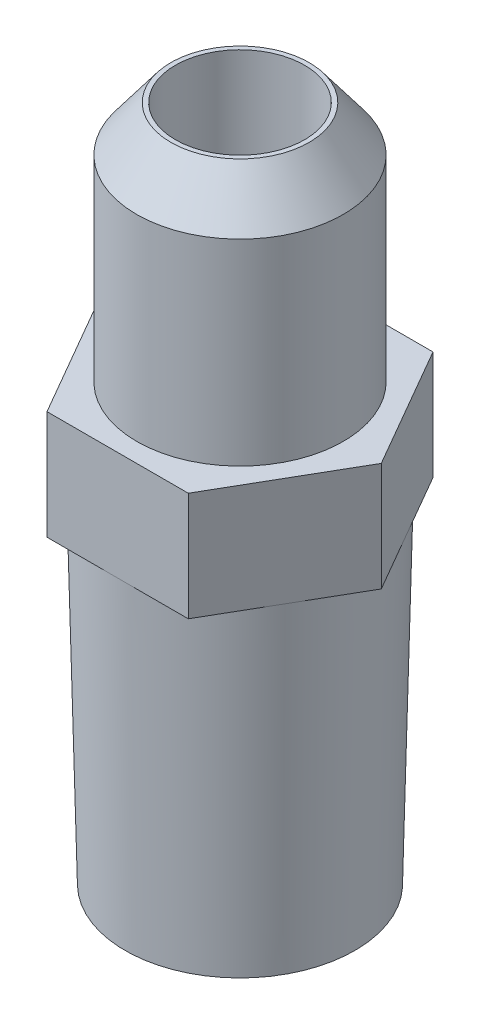
ISO-10303-21;
HEADER;
FILE_DESCRIPTION(('STEP AP214'),'2;1');
FILE_NAME('part.step','',(''),(''),'','','');
FILE_SCHEMA(('AUTOMOTIVE_DESIGN { 1 0 10303 214 1 1 1 1 }'));
ENDSEC;
DATA;
#1=APPLICATION_CONTEXT('core data for automotive mechanical design processes');
#2=APPLICATION_PROTOCOL_DEFINITION('international standard','automotive_design',2000,#1);
#3=PRODUCT_CONTEXT('',#1,'mechanical');
#4=PRODUCT('Part','Part','',(#3));
#5=PRODUCT_RELATED_PRODUCT_CATEGORY('part','',(#4));
#6=PRODUCT_DEFINITION_FORMATION('','',#4);
#7=PRODUCT_DEFINITION_CONTEXT('part definition',#1,'design');
#8=PRODUCT_DEFINITION('design','',#6,#7);
#9=PRODUCT_DEFINITION_SHAPE('','',#8);
#10=(LENGTH_UNIT() NAMED_UNIT(*) SI_UNIT(.MILLI.,.METRE.));
#11=(NAMED_UNIT(*) PLANE_ANGLE_UNIT() SI_UNIT($,.RADIAN.));
#12=(NAMED_UNIT(*) SI_UNIT($,.STERADIAN.) SOLID_ANGLE_UNIT());
#13=UNCERTAINTY_MEASURE_WITH_UNIT(LENGTH_MEASURE(1.E-05),#10,'distance_accuracy_value','');
#14=(GEOMETRIC_REPRESENTATION_CONTEXT(3) GLOBAL_UNCERTAINTY_ASSIGNED_CONTEXT((#13)) GLOBAL_UNIT_ASSIGNED_CONTEXT((#10,
#11,#12)) REPRESENTATION_CONTEXT('',''));
#15=CARTESIAN_POINT('',(0.,0.,0.));
#16=DIRECTION('',(0.,0.,1.));
#17=DIRECTION('',(1.,0.,0.));
#18=AXIS2_PLACEMENT_3D('',#15,#16,#17);
#19=CARTESIAN_POINT('',(0.,0.,0.));
#20=DIRECTION('',(0.,1.,0.));
#21=DIRECTION('',(0.,0.,1.));
#22=AXIS2_PLACEMENT_3D('',#19,#20,#21);
#23=PLANE('',#22);
#24=CARTESIAN_POINT('',(0.,0.,0.));
#25=DIRECTION('',(0.,-1.,0.));
#26=DIRECTION('',(0.,0.,-1.));
#27=AXIS2_PLACEMENT_3D('',#24,#25,#26);
#28=CIRCLE('',#27,7.14375);
#29=CARTESIAN_POINT('',(0.,0.,-7.14375));
#30=VERTEX_POINT('',#29);
#31=CARTESIAN_POINT('',(6.18666897828508,0.,-3.571875));
#32=VERTEX_POINT('',#31);
#33=EDGE_CURVE('E51',#30,#32,#28,.T.);
#34=ORIENTED_EDGE('',*,*,#33,.F.);
#35=DIRECTION('',(-1.,0.,0.));
#36=VECTOR('',#35,1.);
#37=CARTESIAN_POINT('',(4.12444598552338,0.,-7.14375));
#38=LINE('',#37,#36);
#39=CARTESIAN_POINT('',(4.12444598552338,0.,-7.14375));
#40=VERTEX_POINT('',#39);
#41=EDGE_CURVE('E117',#40,#30,#38,.T.);
#42=ORIENTED_EDGE('',*,*,#41,.F.);
#43=DIRECTION('',(-0.5,0.,-0.866025403784439));
#44=VECTOR('',#43,1.);
#45=CARTESIAN_POINT('',(8.24889197104677,0.,0.));
#46=LINE('',#45,#44);
#47=EDGE_CURVE('E142',#32,#40,#46,.T.);
#48=ORIENTED_EDGE('',*,*,#47,.F.);
#49=EDGE_LOOP('',(#34,#42,#48));
#50=FACE_BOUND('',#49,.T.);
#51=ADVANCED_FACE('F39',(#50),#23,.F.);
#52=CARTESIAN_POINT('',(6.18666897828508,0.,3.57187499999999));
#53=VERTEX_POINT('',#52);
#54=EDGE_CURVE('E11',#32,#53,#28,.T.);
#55=ORIENTED_EDGE('',*,*,#54,.F.);
#56=CARTESIAN_POINT('',(8.24889197104677,0.,0.));
#57=VERTEX_POINT('',#56);
#58=EDGE_CURVE('E140',#57,#32,#46,.T.);
#59=ORIENTED_EDGE('',*,*,#58,.F.);
#60=DIRECTION('',(0.5,0.,-0.866025403784439));
#61=VECTOR('',#60,1.);
#62=CARTESIAN_POINT('',(4.12444598552338,0.,7.14375));
#63=LINE('',#62,#61);
#64=EDGE_CURVE('E202',#53,#57,#63,.T.);
#65=ORIENTED_EDGE('',*,*,#64,.F.);
#66=EDGE_LOOP('',(#55,#59,#65));
#67=FACE_BOUND('',#66,.T.);
#68=ADVANCED_FACE('F252',(#67),#23,.F.);
#69=CARTESIAN_POINT('',(0.,0.,7.14375));
#70=VERTEX_POINT('',#69);
#71=EDGE_CURVE('E49',#53,#70,#28,.T.);
#72=ORIENTED_EDGE('',*,*,#71,.F.);
#73=CARTESIAN_POINT('',(4.12444598552338,0.,7.14375));
#74=VERTEX_POINT('',#73);
#75=EDGE_CURVE('E203',#74,#53,#63,.T.);
#76=ORIENTED_EDGE('',*,*,#75,.F.);
#77=DIRECTION('',(1.,0.,0.));
#78=VECTOR('',#77,1.);
#79=CARTESIAN_POINT('',(-4.12444598552339,0.,7.14375));
#80=LINE('',#79,#78);
#81=EDGE_CURVE('E197',#70,#74,#80,.T.);
#82=ORIENTED_EDGE('',*,*,#81,.F.);
#83=EDGE_LOOP('',(#72,#76,#82));
#84=FACE_BOUND('',#83,.T.);
#85=ADVANCED_FACE('F245',(#84),#23,.F.);
#86=CARTESIAN_POINT('',(-6.18666897828508,0.,3.571875));
#87=VERTEX_POINT('',#86);
#88=EDGE_CURVE('E65',#70,#87,#28,.T.);
#89=ORIENTED_EDGE('',*,*,#88,.F.);
#90=CARTESIAN_POINT('',(-4.12444598552339,0.,7.14375));
#91=VERTEX_POINT('',#90);
#92=EDGE_CURVE('E198',#91,#70,#80,.T.);
#93=ORIENTED_EDGE('',*,*,#92,.F.);
#94=DIRECTION('',(0.5,0.,0.866025403784439));
#95=VECTOR('',#94,1.);
#96=CARTESIAN_POINT('',(-8.24889197104678,0.,0.));
#97=LINE('',#96,#95);
#98=EDGE_CURVE('E192',#87,#91,#97,.T.);
#99=ORIENTED_EDGE('',*,*,#98,.F.);
#100=EDGE_LOOP('',(#89,#93,#99));
#101=FACE_BOUND('',#100,.T.);
#102=ADVANCED_FACE('F237',(#101),#23,.F.);
#103=CARTESIAN_POINT('',(-6.18666897828509,0.,-3.571875));
#104=VERTEX_POINT('',#103);
#105=EDGE_CURVE('E58',#87,#104,#28,.T.);
#106=ORIENTED_EDGE('',*,*,#105,.F.);
#107=CARTESIAN_POINT('',(-8.24889197104678,0.,0.));
#108=VERTEX_POINT('',#107);
#109=EDGE_CURVE('E193',#108,#87,#97,.T.);
#110=ORIENTED_EDGE('',*,*,#109,.F.);
#111=DIRECTION('',(-0.5,0.,0.866025403784439));
#112=VECTOR('',#111,1.);
#113=CARTESIAN_POINT('',(-4.12444598552339,0.,-7.14375));
#114=LINE('',#113,#112);
#115=EDGE_CURVE('E169',#104,#108,#114,.T.);
#116=ORIENTED_EDGE('',*,*,#115,.F.);
#117=EDGE_LOOP('',(#106,#110,#116));
#118=FACE_BOUND('',#117,.T.);
#119=ADVANCED_FACE('F234',(#118),#23,.F.);
#120=CARTESIAN_POINT('',(0.,20.4724,0.));
#121=DIRECTION('',(0.,-1.,0.));
#122=DIRECTION('',(0.,0.,-1.));
#123=AXIS2_PLACEMENT_3D('',#120,#121,#122);
#124=CYLINDRICAL_SURFACE('',#123,6.0325);
#125=CARTESIAN_POINT('',(0.,6.35,0.));
#126=DIRECTION('',(0.,1.,0.));
#127=DIRECTION('',(0.,0.,1.));
#128=AXIS2_PLACEMENT_3D('',#125,#126,#127);
#129=CIRCLE('',#128,6.0325);
#130=CARTESIAN_POINT('',(0.,6.35,6.0325));
#131=VERTEX_POINT('',#130);
#132=EDGE_CURVE('E150',#131,#131,#129,.T.);
#133=ORIENTED_EDGE('',*,*,#132,.T.);
#134=EDGE_LOOP('',(#133));
#135=FACE_BOUND('',#134,.T.);
#136=CARTESIAN_POINT('',(0.,17.8264053301711,0.));
#137=DIRECTION('',(0.,-1.,0.));
#138=DIRECTION('',(0.,0.,-1.));
#139=AXIS2_PLACEMENT_3D('',#136,#137,#138);
#140=CIRCLE('',#139,6.0325);
#141=CARTESIAN_POINT('',(0.,17.8264053301711,-6.0325));
#142=VERTEX_POINT('',#141);
#143=EDGE_CURVE('E166',#142,#142,#140,.F.);
#144=ORIENTED_EDGE('',*,*,#143,.F.);
#145=EDGE_LOOP('',(#144));
#146=FACE_BOUND('',#145,.T.);
#147=ADVANCED_FACE('F236',(#135,#146),#124,.T.);
#148=CARTESIAN_POINT('',(-4.12444598552339,6.35,-7.14375));
#149=DIRECTION('',(0.866025403784439,0.,0.5));
#150=DIRECTION('',(0.5,0.,-0.866025403784439));
#151=AXIS2_PLACEMENT_3D('',#148,#149,#150);
#152=PLANE('',#151);
#153=CARTESIAN_POINT('',(-4.12444598552339,0.,-7.14375));
#154=VERTEX_POINT('',#153);
#155=EDGE_CURVE('E138',#154,#104,#114,.T.);
#156=ORIENTED_EDGE('',*,*,#155,.T.);
#157=ORIENTED_EDGE('',*,*,#115,.T.);
#158=DIRECTION('',(0.,-1.,0.));
#159=VECTOR('',#158,1.);
#160=CARTESIAN_POINT('',(-8.24889197104678,6.35,0.));
#161=LINE('',#160,#159);
#162=CARTESIAN_POINT('',(-8.24889197104678,6.35,0.));
#163=VERTEX_POINT('',#162);
#164=EDGE_CURVE('E43',#163,#108,#161,.T.);
#165=ORIENTED_EDGE('',*,*,#164,.F.);
#166=DIRECTION('',(-0.5,0.,0.866025403784439));
#167=VECTOR('',#166,1.);
#168=CARTESIAN_POINT('',(-4.12444598552339,6.35,-7.14375));
#169=LINE('',#168,#167);
#170=CARTESIAN_POINT('',(-4.12444598552339,6.35,-7.14375));
#171=VERTEX_POINT('',#170);
#172=EDGE_CURVE('E130',#171,#163,#169,.T.);
#173=ORIENTED_EDGE('',*,*,#172,.F.);
#174=DIRECTION('',(0.,-1.,0.));
#175=VECTOR('',#174,1.);
#176=CARTESIAN_POINT('',(-4.12444598552339,6.35,-7.14375));
#177=LINE('',#176,#175);
#178=EDGE_CURVE('E189',#171,#154,#177,.T.);
#179=ORIENTED_EDGE('',*,*,#178,.T.);
#180=EDGE_LOOP('',(#156,#157,#165,#173,#179));
#181=FACE_BOUND('',#180,.T.);
#182=ADVANCED_FACE('F41',(#181),#152,.F.);
#183=CARTESIAN_POINT('',(-8.24889197104678,6.35,0.));
#184=DIRECTION('',(0.866025403784439,0.,-0.5));
#185=DIRECTION('',(-0.5,0.,-0.866025403784439));
#186=AXIS2_PLACEMENT_3D('',#183,#184,#185);
#187=PLANE('',#186);
#188=ORIENTED_EDGE('',*,*,#109,.T.);
#189=ORIENTED_EDGE('',*,*,#98,.T.);
#190=DIRECTION('',(0.,-1.,0.));
#191=VECTOR('',#190,1.);
#192=CARTESIAN_POINT('',(-4.12444598552339,6.35,7.14375));
#193=LINE('',#192,#191);
#194=CARTESIAN_POINT('',(-4.12444598552339,6.35,7.14375));
#195=VERTEX_POINT('',#194);
#196=EDGE_CURVE('E220',#195,#91,#193,.T.);
#197=ORIENTED_EDGE('',*,*,#196,.F.);
#198=DIRECTION('',(0.5,0.,0.866025403784439));
#199=VECTOR('',#198,1.);
#200=CARTESIAN_POINT('',(-8.24889197104678,6.35,0.));
#201=LINE('',#200,#199);
#202=EDGE_CURVE('E174',#163,#195,#201,.T.);
#203=ORIENTED_EDGE('',*,*,#202,.F.);
#204=ORIENTED_EDGE('',*,*,#164,.T.);
#205=EDGE_LOOP('',(#188,#189,#197,#203,#204));
#206=FACE_BOUND('',#205,.T.);
#207=ADVANCED_FACE('F230',(#206),#187,.F.);
#208=CARTESIAN_POINT('',(-4.12444598552339,6.35,7.14375));
#209=DIRECTION('',(0.,0.,-1.));
#210=DIRECTION('',(-1.,0.,0.));
#211=AXIS2_PLACEMENT_3D('',#208,#209,#210);
#212=PLANE('',#211);
#213=ORIENTED_EDGE('',*,*,#92,.T.);
#214=ORIENTED_EDGE('',*,*,#81,.T.);
#215=DIRECTION('',(0.,-1.,0.));
#216=VECTOR('',#215,1.);
#217=CARTESIAN_POINT('',(4.12444598552338,6.35,7.14375));
#218=LINE('',#217,#216);
#219=CARTESIAN_POINT('',(4.12444598552338,6.35,7.14375));
#220=VERTEX_POINT('',#219);
#221=EDGE_CURVE('E217',#220,#74,#218,.T.);
#222=ORIENTED_EDGE('',*,*,#221,.F.);
#223=DIRECTION('',(1.,0.,0.));
#224=VECTOR('',#223,1.);
#225=CARTESIAN_POINT('',(-4.12444598552339,6.35,7.14375));
#226=LINE('',#225,#224);
#227=EDGE_CURVE('E177',#195,#220,#226,.T.);
#228=ORIENTED_EDGE('',*,*,#227,.F.);
#229=ORIENTED_EDGE('',*,*,#196,.T.);
#230=EDGE_LOOP('',(#213,#214,#222,#228,#229));
#231=FACE_BOUND('',#230,.T.);
#232=ADVANCED_FACE('F269',(#231),#212,.F.);
#233=CARTESIAN_POINT('',(4.12444598552338,6.35,7.14375));
#234=DIRECTION('',(-0.866025403784439,0.,-0.5));
#235=DIRECTION('',(-0.5,0.,0.866025403784439));
#236=AXIS2_PLACEMENT_3D('',#233,#234,#235);
#237=PLANE('',#236);
#238=ORIENTED_EDGE('',*,*,#75,.T.);
#239=ORIENTED_EDGE('',*,*,#64,.T.);
#240=DIRECTION('',(0.,-1.,0.));
#241=VECTOR('',#240,1.);
#242=CARTESIAN_POINT('',(8.24889197104677,6.35,0.));
#243=LINE('',#242,#241);
#244=CARTESIAN_POINT('',(8.24889197104677,6.35,0.));
#245=VERTEX_POINT('',#244);
#246=EDGE_CURVE('E213',#245,#57,#243,.T.);
#247=ORIENTED_EDGE('',*,*,#246,.F.);
#248=DIRECTION('',(0.5,0.,-0.866025403784439));
#249=VECTOR('',#248,1.);
#250=CARTESIAN_POINT('',(4.12444598552338,6.35,7.14375));
#251=LINE('',#250,#249);
#252=EDGE_CURVE('E180',#220,#245,#251,.T.);
#253=ORIENTED_EDGE('',*,*,#252,.F.);
#254=ORIENTED_EDGE('',*,*,#221,.T.);
#255=EDGE_LOOP('',(#238,#239,#247,#253,#254));
#256=FACE_BOUND('',#255,.T.);
#257=ADVANCED_FACE('F309',(#256),#237,.F.);
#258=CARTESIAN_POINT('',(8.24889197104677,6.35,0.));
#259=DIRECTION('',(-0.866025403784439,0.,0.5));
#260=DIRECTION('',(0.5,0.,0.866025403784439));
#261=AXIS2_PLACEMENT_3D('',#258,#259,#260);
#262=PLANE('',#261);
#263=ORIENTED_EDGE('',*,*,#58,.T.);
#264=ORIENTED_EDGE('',*,*,#47,.T.);
#265=DIRECTION('',(0.,-1.,0.));
#266=VECTOR('',#265,1.);
#267=CARTESIAN_POINT('',(4.12444598552338,6.35,-7.14375));
#268=LINE('',#267,#266);
#269=CARTESIAN_POINT('',(4.12444598552338,6.35,-7.14375));
#270=VERTEX_POINT('',#269);
#271=EDGE_CURVE('E125',#270,#40,#268,.T.);
#272=ORIENTED_EDGE('',*,*,#271,.F.);
#273=DIRECTION('',(-0.5,0.,-0.866025403784439));
#274=VECTOR('',#273,1.);
#275=CARTESIAN_POINT('',(8.24889197104677,6.35,0.));
#276=LINE('',#275,#274);
#277=EDGE_CURVE('E183',#245,#270,#276,.T.);
#278=ORIENTED_EDGE('',*,*,#277,.F.);
#279=ORIENTED_EDGE('',*,*,#246,.T.);
#280=EDGE_LOOP('',(#263,#264,#272,#278,#279));
#281=FACE_BOUND('',#280,.T.);
#282=ADVANCED_FACE('F299',(#281),#262,.F.);
#283=CARTESIAN_POINT('',(4.12444598552338,6.35,-7.14375));
#284=DIRECTION('',(0.,0.,1.));
#285=DIRECTION('',(1.,0.,0.));
#286=AXIS2_PLACEMENT_3D('',#283,#284,#285);
#287=PLANE('',#286);
#288=ORIENTED_EDGE('',*,*,#41,.T.);
#289=EDGE_CURVE('E121',#30,#154,#38,.T.);
#290=ORIENTED_EDGE('',*,*,#289,.T.);
#291=ORIENTED_EDGE('',*,*,#178,.F.);
#292=DIRECTION('',(-1.,0.,0.));
#293=VECTOR('',#292,1.);
#294=CARTESIAN_POINT('',(4.12444598552338,6.35,-7.14375));
#295=LINE('',#294,#293);
#296=EDGE_CURVE('E186',#270,#171,#295,.T.);
#297=ORIENTED_EDGE('',*,*,#296,.F.);
#298=ORIENTED_EDGE('',*,*,#271,.T.);
#299=EDGE_LOOP('',(#288,#290,#291,#297,#298));
#300=FACE_BOUND('',#299,.T.);
#301=ADVANCED_FACE('F119',(#300),#287,.F.);
#302=CARTESIAN_POINT('',(0.,6.35,0.));
#303=DIRECTION('',(0.,1.,0.));
#304=DIRECTION('',(0.,0.,1.));
#305=AXIS2_PLACEMENT_3D('',#302,#303,#304);
#306=PLANE('',#305);
#307=ORIENTED_EDGE('',*,*,#132,.F.);
#308=EDGE_LOOP('',(#307));
#309=FACE_BOUND('',#308,.T.);
#310=ORIENTED_EDGE('',*,*,#172,.T.);
#311=ORIENTED_EDGE('',*,*,#202,.T.);
#312=ORIENTED_EDGE('',*,*,#227,.T.);
#313=ORIENTED_EDGE('',*,*,#252,.T.);
#314=ORIENTED_EDGE('',*,*,#277,.T.);
#315=ORIENTED_EDGE('',*,*,#296,.T.);
#316=EDGE_LOOP('',(#310,#311,#312,#313,#314,#315));
#317=FACE_BOUND('',#316,.T.);
#318=ADVANCED_FACE('F250',(#309,#317),#306,.T.);
#319=EDGE_CURVE('E136',#104,#30,#28,.T.);
#320=ORIENTED_EDGE('',*,*,#319,.F.);
#321=ORIENTED_EDGE('',*,*,#155,.F.);
#322=ORIENTED_EDGE('',*,*,#289,.F.);
#323=EDGE_LOOP('',(#320,#321,#322));
#324=FACE_BOUND('',#323,.T.);
#325=ADVANCED_FACE('F134',(#324),#23,.F.);
#326=CARTESIAN_POINT('',(0.,20.4724,0.));
#327=DIRECTION('',(0.,-1.,0.));
#328=DIRECTION('',(0.,0.,1.));
#329=AXIS2_PLACEMENT_3D('',#326,#327,#328);
#330=CONICAL_SURFACE('',#329,4.0386,0.645771823237903);
#331=CARTESIAN_POINT('',(0.,20.4724,0.));
#332=DIRECTION('',(0.,1.,0.));
#333=DIRECTION('',(0.,0.,1.));
#334=AXIS2_PLACEMENT_3D('',#331,#332,#333);
#335=CIRCLE('',#334,4.0386);
#336=CARTESIAN_POINT('',(0.,20.4724,4.0386));
#337=VERTEX_POINT('',#336);
#338=EDGE_CURVE('E162',#337,#337,#335,.T.);
#339=ORIENTED_EDGE('',*,*,#338,.F.);
#340=EDGE_LOOP('',(#339));
#341=FACE_BOUND('',#340,.T.);
#342=ORIENTED_EDGE('',*,*,#143,.T.);
#343=EDGE_LOOP('',(#342));
#344=FACE_BOUND('',#343,.T.);
#345=ADVANCED_FACE('F249',(#341,#344),#330,.T.);
#346=CARTESIAN_POINT('',(0.,20.4724,0.));
#347=DIRECTION('',(0.,1.,0.));
#348=DIRECTION('',(0.,0.,1.));
#349=AXIS2_PLACEMENT_3D('',#346,#347,#348);
#350=PLANE('',#349);
#351=CARTESIAN_POINT('',(0.,20.4724,0.));
#352=DIRECTION('',(0.,1.,0.));
#353=DIRECTION('',(0.,0.,1.));
#354=AXIS2_PLACEMENT_3D('',#351,#352,#353);
#355=CIRCLE('',#354,3.7719);
#356=CARTESIAN_POINT('',(0.,20.4724,3.7719));
#357=VERTEX_POINT('',#356);
#358=EDGE_CURVE('E157',#357,#357,#355,.T.);
#359=ORIENTED_EDGE('',*,*,#358,.F.);
#360=EDGE_LOOP('',(#359));
#361=FACE_BOUND('',#360,.T.);
#362=ORIENTED_EDGE('',*,*,#338,.T.);
#363=EDGE_LOOP('',(#362));
#364=FACE_BOUND('',#363,.T.);
#365=ADVANCED_FACE('F279',(#361,#364),#350,.T.);
#366=CARTESIAN_POINT('',(0.,0.,0.));
#367=DIRECTION('',(0.,1.,0.));
#368=DIRECTION('',(0.,0.,-1.));
#369=AXIS2_PLACEMENT_3D('',#366,#367,#368);
#370=CONICAL_SURFACE('',#369,7.14375,0.0226892802759263);
#371=CARTESIAN_POINT('',(0.,-19.05,0.));
#372=DIRECTION('',(0.,-1.,0.));
#373=DIRECTION('',(0.,0.,-1.));
#374=AXIS2_PLACEMENT_3D('',#371,#372,#373);
#375=CIRCLE('',#374,6.71144502416799);
#376=CARTESIAN_POINT('',(0.,-19.05,-6.71144502416799));
#377=VERTEX_POINT('',#376);
#378=EDGE_CURVE('E146',#377,#377,#375,.T.);
#379=ORIENTED_EDGE('',*,*,#378,.F.);
#380=EDGE_LOOP('',(#379));
#381=FACE_BOUND('',#380,.T.);
#382=ORIENTED_EDGE('',*,*,#33,.T.);
#383=ORIENTED_EDGE('',*,*,#54,.T.);
#384=ORIENTED_EDGE('',*,*,#71,.T.);
#385=ORIENTED_EDGE('',*,*,#88,.T.);
#386=ORIENTED_EDGE('',*,*,#105,.T.);
#387=ORIENTED_EDGE('',*,*,#319,.T.);
#388=EDGE_LOOP('',(#382,#383,#384,#385,#386,#387));
#389=FACE_BOUND('',#388,.T.);
#390=ADVANCED_FACE('F148',(#381,#389),#370,.T.);
#391=CARTESIAN_POINT('',(0.,-19.05,0.));
#392=DIRECTION('',(0.,-1.,0.));
#393=DIRECTION('',(0.,0.,-1.));
#394=AXIS2_PLACEMENT_3D('',#391,#392,#393);
#395=PLANE('',#394);
#396=CARTESIAN_POINT('',(0.,-19.05,0.));
#397=DIRECTION('',(0.,1.,0.));
#398=DIRECTION('',(0.,0.,1.));
#399=AXIS2_PLACEMENT_3D('',#396,#397,#398);
#400=CIRCLE('',#399,3.7719);
#401=CARTESIAN_POINT('',(0.,-19.05,3.7719));
#402=VERTEX_POINT('',#401);
#403=EDGE_CURVE('E147',#402,#402,#400,.T.);
#404=ORIENTED_EDGE('',*,*,#403,.T.);
#405=EDGE_LOOP('',(#404));
#406=FACE_BOUND('',#405,.T.);
#407=ORIENTED_EDGE('',*,*,#378,.T.);
#408=EDGE_LOOP('',(#407));
#409=FACE_BOUND('',#408,.T.);
#410=ADVANCED_FACE('F369',(#406,#409),#395,.T.);
#411=CARTESIAN_POINT('',(0.,-19.05,0.));
#412=DIRECTION('',(0.,1.,0.));
#413=DIRECTION('',(0.,0.,1.));
#414=AXIS2_PLACEMENT_3D('',#411,#412,#413);
#415=CYLINDRICAL_SURFACE('',#414,3.7719);
#416=ORIENTED_EDGE('',*,*,#403,.F.);
#417=EDGE_LOOP('',(#416));
#418=FACE_BOUND('',#417,.T.);
#419=ORIENTED_EDGE('',*,*,#358,.T.);
#420=EDGE_LOOP('',(#419));
#421=FACE_BOUND('',#420,.T.);
#422=ADVANCED_FACE('F277',(#418,#421),#415,.F.);
#423=CLOSED_SHELL('',(#51,#68,#85,#102,#119,#147,#182,#207,#232,#257,#282,#301,#318,#325,#345,
#365,#390,#410,#422));
#424=MANIFOLD_SOLID_BREP('B2',#423);
#425=ADVANCED_BREP_SHAPE_REPRESENTATION('',(#18,#424),#14);
#426=SHAPE_DEFINITION_REPRESENTATION(#9,#425);
ENDSEC;
END-ISO-10303-21;
